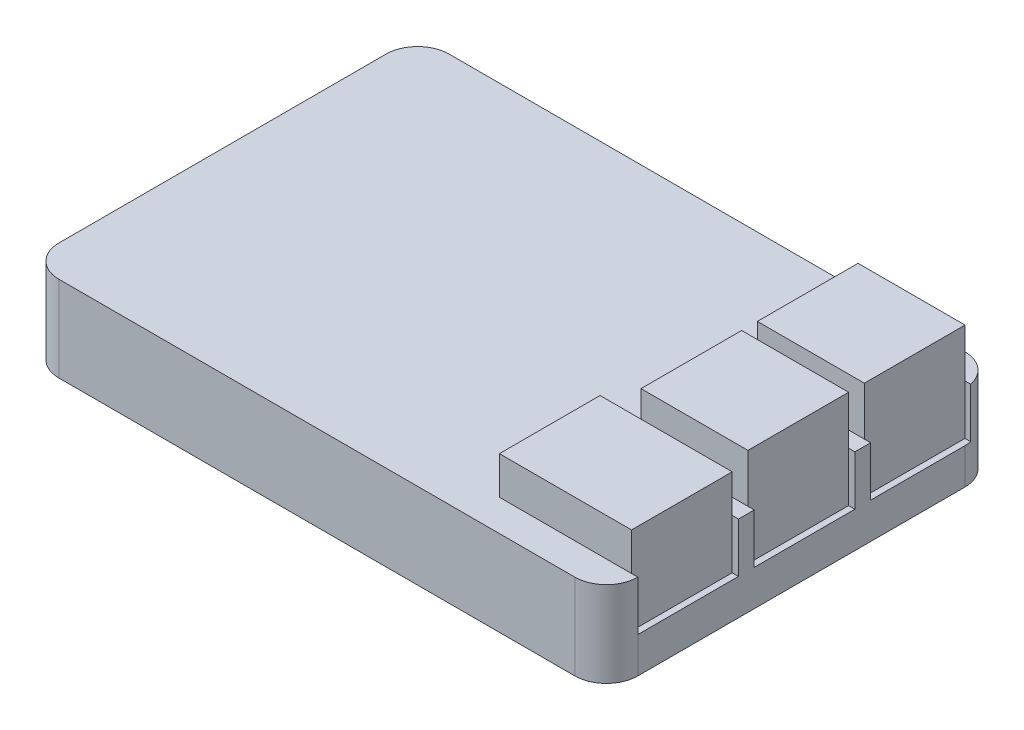
ISO-10303-21;
HEADER;
FILE_DESCRIPTION(('STEP AP214'),'2;1');
FILE_NAME('part.step','',(''),(''),'','','');
FILE_SCHEMA(('AUTOMOTIVE_DESIGN { 1 0 10303 214 1 1 1 1 }'));
ENDSEC;
DATA;
#1=APPLICATION_CONTEXT('core data for automotive mechanical design processes');
#2=APPLICATION_PROTOCOL_DEFINITION('international standard','automotive_design',2000,#1);
#3=PRODUCT_CONTEXT('',#1,'mechanical');
#4=PRODUCT('Part','Part','',(#3));
#5=PRODUCT_RELATED_PRODUCT_CATEGORY('part','',(#4));
#6=PRODUCT_DEFINITION_FORMATION('','',#4);
#7=PRODUCT_DEFINITION_CONTEXT('part definition',#1,'design');
#8=PRODUCT_DEFINITION('design','',#6,#7);
#9=PRODUCT_DEFINITION_SHAPE('','',#8);
#10=(LENGTH_UNIT() NAMED_UNIT(*) SI_UNIT(.MILLI.,.METRE.));
#11=(NAMED_UNIT(*) PLANE_ANGLE_UNIT() SI_UNIT($,.RADIAN.));
#12=(NAMED_UNIT(*) SI_UNIT($,.STERADIAN.) SOLID_ANGLE_UNIT());
#13=UNCERTAINTY_MEASURE_WITH_UNIT(LENGTH_MEASURE(1.E-05),#10,'distance_accuracy_value','');
#14=(GEOMETRIC_REPRESENTATION_CONTEXT(3) GLOBAL_UNCERTAINTY_ASSIGNED_CONTEXT((#13)) GLOBAL_UNIT_ASSIGNED_CONTEXT((#10,
#11,#12)) REPRESENTATION_CONTEXT('',''));
#15=CARTESIAN_POINT('',(0.,0.,0.));
#16=DIRECTION('',(0.,0.,1.));
#17=DIRECTION('',(1.,0.,0.));
#18=AXIS2_PLACEMENT_3D('',#15,#16,#17);
#19=CARTESIAN_POINT('',(0.,13.6,0.));
#20=DIRECTION('',(0.,1.,0.));
#21=DIRECTION('',(0.,0.,1.));
#22=AXIS2_PLACEMENT_3D('',#19,#20,#21);
#23=PLANE('',#22);
#24=DIRECTION('',(0.,0.,1.));
#25=VECTOR('',#24,1.);
#26=CARTESIAN_POINT('',(28.,13.6,0.));
#27=LINE('',#26,#25);
#28=CARTESIAN_POINT('',(28.,13.6,-27.));
#29=VERTEX_POINT('',#28);
#30=CARTESIAN_POINT('',(28.,13.6,-11.));
#31=VERTEX_POINT('',#30);
#32=EDGE_CURVE('E551',#29,#31,#27,.T.);
#33=ORIENTED_EDGE('',*,*,#32,.F.);
#34=DIRECTION('',(-1.,0.,0.));
#35=VECTOR('',#34,1.);
#36=CARTESIAN_POINT('',(0.,13.6,-27.));
#37=LINE('',#36,#35);
#38=CARTESIAN_POINT('',(45.,13.6,-27.));
#39=VERTEX_POINT('',#38);
#40=EDGE_CURVE('E246',#39,#29,#37,.T.);
#41=ORIENTED_EDGE('',*,*,#40,.F.);
#42=DIRECTION('',(1.,0.,0.));
#43=VECTOR('',#42,1.);
#44=CARTESIAN_POINT('',(45.,13.6,-27.));
#45=LINE('',#44,#43);
#46=CARTESIAN_POINT('',(45.8989794855664,13.6,-27.));
#47=VERTEX_POINT('',#46);
#48=EDGE_CURVE('E324',#39,#47,#45,.T.);
#49=ORIENTED_EDGE('',*,*,#48,.T.);
#50=CARTESIAN_POINT('',(41.,13.6,-26.));
#51=DIRECTION('',(0.,1.,0.));
#52=DIRECTION('',(0.,0.,1.));
#53=AXIS2_PLACEMENT_3D('',#50,#51,#52);
#54=CIRCLE('',#53,5.);
#55=CARTESIAN_POINT('',(41.,13.6,-31.));
#56=VERTEX_POINT('',#55);
#57=EDGE_CURVE('E397',#47,#56,#54,.T.);
#58=ORIENTED_EDGE('',*,*,#57,.T.);
#59=DIRECTION('',(1.,0.,0.));
#60=VECTOR('',#59,1.);
#61=CARTESIAN_POINT('',(0.,13.6,-31.));
#62=LINE('',#61,#60);
#63=CARTESIAN_POINT('',(-41.,13.6,-31.));
#64=VERTEX_POINT('',#63);
#65=EDGE_CURVE('E399',#64,#56,#62,.T.);
#66=ORIENTED_EDGE('',*,*,#65,.F.);
#67=CARTESIAN_POINT('',(-41.,13.6,-26.));
#68=DIRECTION('',(0.,1.,0.));
#69=DIRECTION('',(0.,0.,1.));
#70=AXIS2_PLACEMENT_3D('',#67,#68,#69);
#71=CIRCLE('',#70,5.);
#72=CARTESIAN_POINT('',(-46.,13.6,-26.));
#73=VERTEX_POINT('',#72);
#74=EDGE_CURVE('E402',#64,#73,#71,.T.);
#75=ORIENTED_EDGE('',*,*,#74,.T.);
#76=DIRECTION('',(0.,0.,1.));
#77=VECTOR('',#76,1.);
#78=CARTESIAN_POINT('',(-46.,13.6,0.));
#79=LINE('',#78,#77);
#80=CARTESIAN_POINT('',(-46.,13.6,26.));
#81=VERTEX_POINT('',#80);
#82=EDGE_CURVE('E383',#73,#81,#79,.T.);
#83=ORIENTED_EDGE('',*,*,#82,.T.);
#84=CARTESIAN_POINT('',(-41.,13.6,26.));
#85=DIRECTION('',(0.,1.,0.));
#86=DIRECTION('',(0.,0.,1.));
#87=AXIS2_PLACEMENT_3D('',#84,#85,#86);
#88=CIRCLE('',#87,5.);
#89=CARTESIAN_POINT('',(-41.,13.6,31.));
#90=VERTEX_POINT('',#89);
#91=EDGE_CURVE('E386',#81,#90,#88,.T.);
#92=ORIENTED_EDGE('',*,*,#91,.T.);
#93=DIRECTION('',(1.,0.,0.));
#94=VECTOR('',#93,1.);
#95=CARTESIAN_POINT('',(0.,13.6,31.));
#96=LINE('',#95,#94);
#97=CARTESIAN_POINT('',(41.,13.6,31.));
#98=VERTEX_POINT('',#97);
#99=EDGE_CURVE('E389',#90,#98,#96,.T.);
#100=ORIENTED_EDGE('',*,*,#99,.T.);
#101=CARTESIAN_POINT('',(41.,13.6,26.));
#102=DIRECTION('',(0.,1.,0.));
#103=DIRECTION('',(0.,0.,1.));
#104=AXIS2_PLACEMENT_3D('',#101,#102,#103);
#105=CIRCLE('',#104,5.);
#106=CARTESIAN_POINT('',(46.,13.6,26.));
#107=VERTEX_POINT('',#106);
#108=EDGE_CURVE('E391',#98,#107,#105,.T.);
#109=ORIENTED_EDGE('',*,*,#108,.T.);
#110=DIRECTION('',(1.,0.,0.));
#111=VECTOR('',#110,1.);
#112=CARTESIAN_POINT('',(45.,13.6,26.));
#113=LINE('',#112,#111);
#114=CARTESIAN_POINT('',(45.,13.6,26.));
#115=VERTEX_POINT('',#114);
#116=EDGE_CURVE('E375',#115,#107,#113,.T.);
#117=ORIENTED_EDGE('',*,*,#116,.F.);
#118=DIRECTION('',(-1.,0.,0.));
#119=VECTOR('',#118,1.);
#120=CARTESIAN_POINT('',(0.,13.6,26.));
#121=LINE('',#120,#119);
#122=CARTESIAN_POINT('',(24.,13.6,26.));
#123=VERTEX_POINT('',#122);
#124=EDGE_CURVE('E285',#115,#123,#121,.T.);
#125=ORIENTED_EDGE('',*,*,#124,.T.);
#126=DIRECTION('',(0.,0.,1.));
#127=VECTOR('',#126,1.);
#128=CARTESIAN_POINT('',(24.,13.6,0.));
#129=LINE('',#128,#127);
#130=CARTESIAN_POINT('',(24.,13.6,10.));
#131=VERTEX_POINT('',#130);
#132=EDGE_CURVE('E50',#131,#123,#129,.T.);
#133=ORIENTED_EDGE('',*,*,#132,.F.);
#134=DIRECTION('',(-1.,0.,0.));
#135=VECTOR('',#134,1.);
#136=CARTESIAN_POINT('',(0.,13.6,10.));
#137=LINE('',#136,#135);
#138=CARTESIAN_POINT('',(45.,13.6,10.));
#139=VERTEX_POINT('',#138);
#140=EDGE_CURVE('E55',#139,#131,#137,.T.);
#141=ORIENTED_EDGE('',*,*,#140,.F.);
#142=DIRECTION('',(1.,0.,0.));
#143=VECTOR('',#142,1.);
#144=CARTESIAN_POINT('',(45.,13.6,10.));
#145=LINE('',#144,#143);
#146=CARTESIAN_POINT('',(46.,13.6,10.));
#147=VERTEX_POINT('',#146);
#148=EDGE_CURVE('E378',#139,#147,#145,.T.);
#149=ORIENTED_EDGE('',*,*,#148,.T.);
#150=DIRECTION('',(0.,0.,1.));
#151=VECTOR('',#150,1.);
#152=CARTESIAN_POINT('',(46.,13.6,0.));
#153=LINE('',#152,#151);
#154=CARTESIAN_POINT('',(46.,13.6,7.5));
#155=VERTEX_POINT('',#154);
#156=EDGE_CURVE('E394',#155,#147,#153,.T.);
#157=ORIENTED_EDGE('',*,*,#156,.F.);
#158=DIRECTION('',(1.,0.,0.));
#159=VECTOR('',#158,1.);
#160=CARTESIAN_POINT('',(45.,13.6,7.5));
#161=LINE('',#160,#159);
#162=CARTESIAN_POINT('',(45.,13.6,7.5));
#163=VERTEX_POINT('',#162);
#164=EDGE_CURVE('E352',#163,#155,#161,.T.);
#165=ORIENTED_EDGE('',*,*,#164,.F.);
#166=DIRECTION('',(-1.,0.,0.));
#167=VECTOR('',#166,1.);
#168=CARTESIAN_POINT('',(0.,13.6,7.50000000000001));
#169=LINE('',#168,#167);
#170=CARTESIAN_POINT('',(28.,13.6,7.50000000000001));
#171=VERTEX_POINT('',#170);
#172=EDGE_CURVE('E261',#163,#171,#169,.T.);
#173=ORIENTED_EDGE('',*,*,#172,.T.);
#174=DIRECTION('',(0.,0.,1.));
#175=VECTOR('',#174,1.);
#176=CARTESIAN_POINT('',(28.,13.6,0.));
#177=LINE('',#176,#175);
#178=CARTESIAN_POINT('',(28.,13.6,-8.49999999999999));
#179=VERTEX_POINT('',#178);
#180=EDGE_CURVE('E251',#179,#171,#177,.T.);
#181=ORIENTED_EDGE('',*,*,#180,.F.);
#182=DIRECTION('',(-1.,0.,0.));
#183=VECTOR('',#182,1.);
#184=CARTESIAN_POINT('',(0.,13.6,-8.49999999999999));
#185=LINE('',#184,#183);
#186=CARTESIAN_POINT('',(45.,13.6,-8.49999999999999));
#187=VERTEX_POINT('',#186);
#188=EDGE_CURVE('E248',#187,#179,#185,.T.);
#189=ORIENTED_EDGE('',*,*,#188,.F.);
#190=DIRECTION('',(1.,0.,0.));
#191=VECTOR('',#190,1.);
#192=CARTESIAN_POINT('',(45.,13.6,-8.49999999999999));
#193=LINE('',#192,#191);
#194=CARTESIAN_POINT('',(46.,13.6,-8.49999999999999));
#195=VERTEX_POINT('',#194);
#196=EDGE_CURVE('E355',#187,#195,#193,.T.);
#197=ORIENTED_EDGE('',*,*,#196,.T.);
#198=CARTESIAN_POINT('',(46.,13.6,-11.));
#199=VERTEX_POINT('',#198);
#200=EDGE_CURVE('E395',#199,#195,#153,.T.);
#201=ORIENTED_EDGE('',*,*,#200,.F.);
#202=DIRECTION('',(1.,0.,0.));
#203=VECTOR('',#202,1.);
#204=CARTESIAN_POINT('',(45.,13.6,-11.));
#205=LINE('',#204,#203);
#206=CARTESIAN_POINT('',(45.,13.6,-11.));
#207=VERTEX_POINT('',#206);
#208=EDGE_CURVE('E321',#207,#199,#205,.T.);
#209=ORIENTED_EDGE('',*,*,#208,.F.);
#210=DIRECTION('',(-1.,0.,0.));
#211=VECTOR('',#210,1.);
#212=CARTESIAN_POINT('',(0.,13.6,-11.));
#213=LINE('',#212,#211);
#214=EDGE_CURVE('E242',#207,#31,#213,.T.);
#215=ORIENTED_EDGE('',*,*,#214,.T.);
#216=EDGE_LOOP('',(#33,#41,#49,#58,#66,#75,#83,#92,#100,#109,#117,#125,#133,#141,#149,#157,#165,
#173,#181,#189,#197,#201,#209,#215));
#217=FACE_BOUND('',#216,.T.);
#218=ADVANCED_FACE('F35',(#217),#23,.T.);
#219=CARTESIAN_POINT('',(-46.,13.6,0.));
#220=DIRECTION('',(1.,0.,0.));
#221=DIRECTION('',(0.,0.,-1.));
#222=AXIS2_PLACEMENT_3D('',#219,#220,#221);
#223=PLANE('',#222);
#224=DIRECTION('',(0.,0.,1.));
#225=VECTOR('',#224,1.);
#226=CARTESIAN_POINT('',(-46.,0.,0.));
#227=LINE('',#226,#225);
#228=CARTESIAN_POINT('',(-46.,0.,-26.));
#229=VERTEX_POINT('',#228);
#230=CARTESIAN_POINT('',(-46.,0.,26.));
#231=VERTEX_POINT('',#230);
#232=EDGE_CURVE('E377',#229,#231,#227,.T.);
#233=ORIENTED_EDGE('',*,*,#232,.T.);
#234=DIRECTION('',(0.,-1.,0.));
#235=VECTOR('',#234,1.);
#236=CARTESIAN_POINT('',(-46.,13.6,26.));
#237=LINE('',#236,#235);
#238=EDGE_CURVE('E43',#81,#231,#237,.T.);
#239=ORIENTED_EDGE('',*,*,#238,.F.);
#240=ORIENTED_EDGE('',*,*,#82,.F.);
#241=DIRECTION('',(0.,-1.,0.));
#242=VECTOR('',#241,1.);
#243=CARTESIAN_POINT('',(-46.,13.6,-26.));
#244=LINE('',#243,#242);
#245=EDGE_CURVE('E404',#73,#229,#244,.T.);
#246=ORIENTED_EDGE('',*,*,#245,.T.);
#247=EDGE_LOOP('',(#233,#239,#240,#246));
#248=FACE_BOUND('',#247,.T.);
#249=ADVANCED_FACE('F37',(#248),#223,.F.);
#250=CARTESIAN_POINT('',(-41.,13.6,26.));
#251=DIRECTION('',(0.,-1.,0.));
#252=DIRECTION('',(0.,0.,-1.));
#253=AXIS2_PLACEMENT_3D('',#250,#251,#252);
#254=CYLINDRICAL_SURFACE('',#253,5.);
#255=CARTESIAN_POINT('',(-41.,0.,26.));
#256=DIRECTION('',(0.,1.,0.));
#257=DIRECTION('',(0.,0.,1.));
#258=AXIS2_PLACEMENT_3D('',#255,#256,#257);
#259=CIRCLE('',#258,5.);
#260=CARTESIAN_POINT('',(-41.,0.,31.));
#261=VERTEX_POINT('',#260);
#262=EDGE_CURVE('E407',#231,#261,#259,.T.);
#263=ORIENTED_EDGE('',*,*,#262,.T.);
#264=DIRECTION('',(0.,-1.,0.));
#265=VECTOR('',#264,1.);
#266=CARTESIAN_POINT('',(-41.,13.6,31.));
#267=LINE('',#266,#265);
#268=EDGE_CURVE('E439',#90,#261,#267,.T.);
#269=ORIENTED_EDGE('',*,*,#268,.F.);
#270=ORIENTED_EDGE('',*,*,#91,.F.);
#271=ORIENTED_EDGE('',*,*,#238,.T.);
#272=EDGE_LOOP('',(#263,#269,#270,#271));
#273=FACE_BOUND('',#272,.T.);
#274=ADVANCED_FACE('F444',(#273),#254,.T.);
#275=CARTESIAN_POINT('',(0.,13.6,31.));
#276=DIRECTION('',(0.,0.,-1.));
#277=DIRECTION('',(-1.,0.,0.));
#278=AXIS2_PLACEMENT_3D('',#275,#276,#277);
#279=PLANE('',#278);
#280=DIRECTION('',(1.,0.,0.));
#281=VECTOR('',#280,1.);
#282=CARTESIAN_POINT('',(0.,0.,31.));
#283=LINE('',#282,#281);
#284=CARTESIAN_POINT('',(41.,0.,31.));
#285=VERTEX_POINT('',#284);
#286=EDGE_CURVE('E409',#261,#285,#283,.T.);
#287=ORIENTED_EDGE('',*,*,#286,.T.);
#288=DIRECTION('',(0.,-1.,0.));
#289=VECTOR('',#288,1.);
#290=CARTESIAN_POINT('',(41.,13.6,31.));
#291=LINE('',#290,#289);
#292=EDGE_CURVE('E436',#98,#285,#291,.T.);
#293=ORIENTED_EDGE('',*,*,#292,.F.);
#294=ORIENTED_EDGE('',*,*,#99,.F.);
#295=ORIENTED_EDGE('',*,*,#268,.T.);
#296=EDGE_LOOP('',(#287,#293,#294,#295));
#297=FACE_BOUND('',#296,.T.);
#298=ADVANCED_FACE('F458',(#297),#279,.F.);
#299=CARTESIAN_POINT('',(41.,13.6,26.));
#300=DIRECTION('',(0.,-1.,0.));
#301=DIRECTION('',(0.,0.,-1.));
#302=AXIS2_PLACEMENT_3D('',#299,#300,#301);
#303=CYLINDRICAL_SURFACE('',#302,5.);
#304=CARTESIAN_POINT('',(41.,0.,26.));
#305=DIRECTION('',(0.,1.,0.));
#306=DIRECTION('',(0.,0.,1.));
#307=AXIS2_PLACEMENT_3D('',#304,#305,#306);
#308=CIRCLE('',#307,5.);
#309=CARTESIAN_POINT('',(46.,0.,26.));
#310=VERTEX_POINT('',#309);
#311=EDGE_CURVE('E411',#285,#310,#308,.T.);
#312=ORIENTED_EDGE('',*,*,#311,.T.);
#313=DIRECTION('',(0.,-1.,0.));
#314=VECTOR('',#313,1.);
#315=CARTESIAN_POINT('',(46.,13.6,26.));
#316=LINE('',#315,#314);
#317=CARTESIAN_POINT('',(46.,5.7,26.));
#318=VERTEX_POINT('',#317);
#319=EDGE_CURVE('E432',#318,#310,#316,.T.);
#320=ORIENTED_EDGE('',*,*,#319,.F.);
#321=EDGE_CURVE('E433',#107,#318,#316,.T.);
#322=ORIENTED_EDGE('',*,*,#321,.F.);
#323=ORIENTED_EDGE('',*,*,#108,.F.);
#324=ORIENTED_EDGE('',*,*,#292,.T.);
#325=EDGE_LOOP('',(#312,#320,#322,#323,#324));
#326=FACE_BOUND('',#325,.T.);
#327=ADVANCED_FACE('F462',(#326),#303,.T.);
#328=CARTESIAN_POINT('',(46.,13.6,0.));
#329=DIRECTION('',(1.,0.,0.));
#330=DIRECTION('',(0.,0.,-1.));
#331=AXIS2_PLACEMENT_3D('',#328,#329,#330);
#332=PLANE('',#331);
#333=DIRECTION('',(0.,-1.,0.));
#334=VECTOR('',#333,1.);
#335=CARTESIAN_POINT('',(46.,13.6,-11.));
#336=LINE('',#335,#334);
#337=CARTESIAN_POINT('',(46.,5.7,-11.));
#338=VERTEX_POINT('',#337);
#339=EDGE_CURVE('E306',#199,#338,#336,.T.);
#340=ORIENTED_EDGE('',*,*,#339,.F.);
#341=ORIENTED_EDGE('',*,*,#200,.T.);
#342=DIRECTION('',(0.,1.,0.));
#343=VECTOR('',#342,1.);
#344=CARTESIAN_POINT('',(46.,13.6,-8.49999999999999));
#345=LINE('',#344,#343);
#346=CARTESIAN_POINT('',(46.,5.7,-8.49999999999999));
#347=VERTEX_POINT('',#346);
#348=EDGE_CURVE('E338',#347,#195,#345,.T.);
#349=ORIENTED_EDGE('',*,*,#348,.F.);
#350=DIRECTION('',(0.,0.,-1.));
#351=VECTOR('',#350,1.);
#352=CARTESIAN_POINT('',(46.,5.7,7.50000000000001));
#353=LINE('',#352,#351);
#354=CARTESIAN_POINT('',(46.,5.7,7.50000000000001));
#355=VERTEX_POINT('',#354);
#356=EDGE_CURVE('E347',#355,#347,#353,.T.);
#357=ORIENTED_EDGE('',*,*,#356,.F.);
#358=DIRECTION('',(0.,-1.,0.));
#359=VECTOR('',#358,1.);
#360=CARTESIAN_POINT('',(46.,13.6,7.5));
#361=LINE('',#360,#359);
#362=EDGE_CURVE('E333',#155,#355,#361,.T.);
#363=ORIENTED_EDGE('',*,*,#362,.F.);
#364=ORIENTED_EDGE('',*,*,#156,.T.);
#365=DIRECTION('',(0.,1.,0.));
#366=VECTOR('',#365,1.);
#367=CARTESIAN_POINT('',(46.,13.6,10.));
#368=LINE('',#367,#366);
#369=CARTESIAN_POINT('',(46.,5.7,10.));
#370=VERTEX_POINT('',#369);
#371=EDGE_CURVE('E365',#370,#147,#368,.T.);
#372=ORIENTED_EDGE('',*,*,#371,.F.);
#373=DIRECTION('',(0.,0.,-1.));
#374=VECTOR('',#373,1.);
#375=CARTESIAN_POINT('',(46.,5.7,26.));
#376=LINE('',#375,#374);
#377=EDGE_CURVE('E354',#318,#370,#376,.T.);
#378=ORIENTED_EDGE('',*,*,#377,.F.);
#379=ORIENTED_EDGE('',*,*,#319,.T.);
#380=DIRECTION('',(0.,0.,1.));
#381=VECTOR('',#380,1.);
#382=CARTESIAN_POINT('',(46.,0.,0.));
#383=LINE('',#382,#381);
#384=CARTESIAN_POINT('',(46.,0.,-26.));
#385=VERTEX_POINT('',#384);
#386=EDGE_CURVE('E414',#385,#310,#383,.T.);
#387=ORIENTED_EDGE('',*,*,#386,.F.);
#388=DIRECTION('',(0.,-1.,0.));
#389=VECTOR('',#388,1.);
#390=CARTESIAN_POINT('',(46.,13.6,-26.));
#391=LINE('',#390,#389);
#392=CARTESIAN_POINT('',(46.,5.7,-26.));
#393=VERTEX_POINT('',#392);
#394=EDGE_CURVE('E430',#393,#385,#391,.T.);
#395=ORIENTED_EDGE('',*,*,#394,.F.);
#396=DIRECTION('',(0.,0.,-1.));
#397=VECTOR('',#396,1.);
#398=CARTESIAN_POINT('',(46.,5.7,-11.));
#399=LINE('',#398,#397);
#400=EDGE_CURVE('E311',#338,#393,#399,.T.);
#401=ORIENTED_EDGE('',*,*,#400,.F.);
#402=EDGE_LOOP('',(#340,#341,#349,#357,#363,#364,#372,#378,#379,#387,#395,#401));
#403=FACE_BOUND('',#402,.T.);
#404=ADVANCED_FACE('F479',(#403),#332,.T.);
#405=CARTESIAN_POINT('',(41.,13.6,-26.));
#406=DIRECTION('',(0.,-1.,0.));
#407=DIRECTION('',(0.,0.,-1.));
#408=AXIS2_PLACEMENT_3D('',#405,#406,#407);
#409=CYLINDRICAL_SURFACE('',#408,5.);
#410=ORIENTED_EDGE('',*,*,#57,.F.);
#411=DIRECTION('',(0.,-1.,0.));
#412=VECTOR('',#411,1.);
#413=CARTESIAN_POINT('',(45.8989794855664,13.6,-27.));
#414=LINE('',#413,#412);
#415=CARTESIAN_POINT('',(45.8989794855664,5.7,-27.));
#416=VERTEX_POINT('',#415);
#417=EDGE_CURVE('E323',#47,#416,#414,.T.);
#418=ORIENTED_EDGE('',*,*,#417,.T.);
#419=CARTESIAN_POINT('',(41.,5.7,-26.));
#420=DIRECTION('',(0.,-1.,0.));
#421=DIRECTION('',(0.,0.,-1.));
#422=AXIS2_PLACEMENT_3D('',#419,#420,#421);
#423=CIRCLE('',#422,5.);
#424=EDGE_CURVE('E11',#416,#393,#423,.T.);
#425=ORIENTED_EDGE('',*,*,#424,.T.);
#426=ORIENTED_EDGE('',*,*,#394,.T.);
#427=CARTESIAN_POINT('',(41.,0.,-26.));
#428=DIRECTION('',(0.,1.,0.));
#429=DIRECTION('',(0.,0.,1.));
#430=AXIS2_PLACEMENT_3D('',#427,#428,#429);
#431=CIRCLE('',#430,5.);
#432=CARTESIAN_POINT('',(41.,0.,-31.));
#433=VERTEX_POINT('',#432);
#434=EDGE_CURVE('E417',#385,#433,#431,.T.);
#435=ORIENTED_EDGE('',*,*,#434,.T.);
#436=DIRECTION('',(0.,-1.,0.));
#437=VECTOR('',#436,1.);
#438=CARTESIAN_POINT('',(41.,13.6,-31.));
#439=LINE('',#438,#437);
#440=EDGE_CURVE('E428',#56,#433,#439,.T.);
#441=ORIENTED_EDGE('',*,*,#440,.F.);
#442=EDGE_LOOP('',(#410,#418,#425,#426,#435,#441));
#443=FACE_BOUND('',#442,.T.);
#444=ADVANCED_FACE('F561',(#443),#409,.T.);
#445=CARTESIAN_POINT('',(0.,13.6,-31.));
#446=DIRECTION('',(0.,0.,-1.));
#447=DIRECTION('',(-1.,0.,0.));
#448=AXIS2_PLACEMENT_3D('',#445,#446,#447);
#449=PLANE('',#448);
#450=DIRECTION('',(1.,0.,0.));
#451=VECTOR('',#450,1.);
#452=CARTESIAN_POINT('',(0.,0.,-31.));
#453=LINE('',#452,#451);
#454=CARTESIAN_POINT('',(-41.,0.,-31.));
#455=VERTEX_POINT('',#454);
#456=EDGE_CURVE('E420',#455,#433,#453,.T.);
#457=ORIENTED_EDGE('',*,*,#456,.F.);
#458=DIRECTION('',(0.,-1.,0.));
#459=VECTOR('',#458,1.);
#460=CARTESIAN_POINT('',(-41.,13.6,-31.));
#461=LINE('',#460,#459);
#462=EDGE_CURVE('E426',#64,#455,#461,.T.);
#463=ORIENTED_EDGE('',*,*,#462,.F.);
#464=ORIENTED_EDGE('',*,*,#65,.T.);
#465=ORIENTED_EDGE('',*,*,#440,.T.);
#466=EDGE_LOOP('',(#457,#463,#464,#465));
#467=FACE_BOUND('',#466,.T.);
#468=ADVANCED_FACE('F471',(#467),#449,.T.);
#469=CARTESIAN_POINT('',(-41.,13.6,-26.));
#470=DIRECTION('',(0.,-1.,0.));
#471=DIRECTION('',(0.,0.,-1.));
#472=AXIS2_PLACEMENT_3D('',#469,#470,#471);
#473=CYLINDRICAL_SURFACE('',#472,5.);
#474=CARTESIAN_POINT('',(-41.,0.,-26.));
#475=DIRECTION('',(0.,1.,0.));
#476=DIRECTION('',(0.,0.,1.));
#477=AXIS2_PLACEMENT_3D('',#474,#475,#476);
#478=CIRCLE('',#477,5.);
#479=EDGE_CURVE('E387',#455,#229,#478,.T.);
#480=ORIENTED_EDGE('',*,*,#479,.T.);
#481=ORIENTED_EDGE('',*,*,#245,.F.);
#482=ORIENTED_EDGE('',*,*,#74,.F.);
#483=ORIENTED_EDGE('',*,*,#462,.T.);
#484=EDGE_LOOP('',(#480,#481,#482,#483));
#485=FACE_BOUND('',#484,.T.);
#486=ADVANCED_FACE('F469',(#485),#473,.T.);
#487=CARTESIAN_POINT('',(0.,0.,0.));
#488=DIRECTION('',(0.,1.,0.));
#489=DIRECTION('',(0.,0.,1.));
#490=AXIS2_PLACEMENT_3D('',#487,#488,#489);
#491=PLANE('',#490);
#492=ORIENTED_EDGE('',*,*,#232,.F.);
#493=ORIENTED_EDGE('',*,*,#479,.F.);
#494=ORIENTED_EDGE('',*,*,#456,.T.);
#495=ORIENTED_EDGE('',*,*,#434,.F.);
#496=ORIENTED_EDGE('',*,*,#386,.T.);
#497=ORIENTED_EDGE('',*,*,#311,.F.);
#498=ORIENTED_EDGE('',*,*,#286,.F.);
#499=ORIENTED_EDGE('',*,*,#262,.F.);
#500=EDGE_LOOP('',(#492,#493,#494,#495,#496,#497,#498,#499));
#501=FACE_BOUND('',#500,.T.);
#502=ADVANCED_FACE('F452',(#501),#491,.F.);
#503=CARTESIAN_POINT('',(45.,13.6,26.));
#504=DIRECTION('',(0.,0.,1.));
#505=DIRECTION('',(1.,0.,0.));
#506=AXIS2_PLACEMENT_3D('',#503,#504,#505);
#507=PLANE('',#506);
#508=ORIENTED_EDGE('',*,*,#321,.T.);
#509=DIRECTION('',(1.,0.,0.));
#510=VECTOR('',#509,1.);
#511=CARTESIAN_POINT('',(45.,5.7,26.));
#512=LINE('',#511,#510);
#513=CARTESIAN_POINT('',(45.,5.7,26.));
#514=VERTEX_POINT('',#513);
#515=EDGE_CURVE('E370',#514,#318,#512,.T.);
#516=ORIENTED_EDGE('',*,*,#515,.F.);
#517=DIRECTION('',(0.,-1.,0.));
#518=VECTOR('',#517,1.);
#519=CARTESIAN_POINT('',(45.,13.6,26.));
#520=LINE('',#519,#518);
#521=EDGE_CURVE('E361',#115,#514,#520,.T.);
#522=ORIENTED_EDGE('',*,*,#521,.F.);
#523=ORIENTED_EDGE('',*,*,#116,.T.);
#524=EDGE_LOOP('',(#508,#516,#522,#523));
#525=FACE_BOUND('',#524,.T.);
#526=ADVANCED_FACE('F488',(#525),#507,.F.);
#527=CARTESIAN_POINT('',(45.,13.6,10.));
#528=DIRECTION('',(0.,0.,-1.));
#529=DIRECTION('',(-1.,0.,0.));
#530=AXIS2_PLACEMENT_3D('',#527,#528,#529);
#531=PLANE('',#530);
#532=ORIENTED_EDGE('',*,*,#371,.T.);
#533=ORIENTED_EDGE('',*,*,#148,.F.);
#534=DIRECTION('',(0.,1.,0.));
#535=VECTOR('',#534,1.);
#536=CARTESIAN_POINT('',(45.,13.6,10.));
#537=LINE('',#536,#535);
#538=CARTESIAN_POINT('',(45.,5.7,10.));
#539=VERTEX_POINT('',#538);
#540=EDGE_CURVE('E368',#539,#139,#537,.T.);
#541=ORIENTED_EDGE('',*,*,#540,.F.);
#542=DIRECTION('',(1.,0.,0.));
#543=VECTOR('',#542,1.);
#544=CARTESIAN_POINT('',(45.,5.7,10.));
#545=LINE('',#544,#543);
#546=EDGE_CURVE('E380',#539,#370,#545,.T.);
#547=ORIENTED_EDGE('',*,*,#546,.T.);
#548=EDGE_LOOP('',(#532,#533,#541,#547));
#549=FACE_BOUND('',#548,.T.);
#550=ADVANCED_FACE('F506',(#549),#531,.F.);
#551=CARTESIAN_POINT('',(45.,5.7,26.));
#552=DIRECTION('',(0.,-1.,0.));
#553=DIRECTION('',(0.,0.,-1.));
#554=AXIS2_PLACEMENT_3D('',#551,#552,#553);
#555=PLANE('',#554);
#556=ORIENTED_EDGE('',*,*,#377,.T.);
#557=ORIENTED_EDGE('',*,*,#546,.F.);
#558=DIRECTION('',(0.,0.,-1.));
#559=VECTOR('',#558,1.);
#560=CARTESIAN_POINT('',(45.,5.7,26.));
#561=LINE('',#560,#559);
#562=EDGE_CURVE('E364',#514,#539,#561,.T.);
#563=ORIENTED_EDGE('',*,*,#562,.F.);
#564=ORIENTED_EDGE('',*,*,#515,.T.);
#565=EDGE_LOOP('',(#556,#557,#563,#564));
#566=FACE_BOUND('',#565,.T.);
#567=ADVANCED_FACE('F484',(#566),#555,.F.);
#568=CARTESIAN_POINT('',(45.,0.,0.));
#569=DIRECTION('',(1.,0.,0.));
#570=DIRECTION('',(0.,0.,-1.));
#571=AXIS2_PLACEMENT_3D('',#568,#569,#570);
#572=PLANE('',#571);
#573=ORIENTED_EDGE('',*,*,#521,.T.);
#574=ORIENTED_EDGE('',*,*,#562,.T.);
#575=ORIENTED_EDGE('',*,*,#540,.T.);
#576=DIRECTION('',(0.,-1.,0.));
#577=VECTOR('',#576,1.);
#578=CARTESIAN_POINT('',(45.,19.6,10.));
#579=LINE('',#578,#577);
#580=CARTESIAN_POINT('',(45.,19.6,10.));
#581=VERTEX_POINT('',#580);
#582=EDGE_CURVE('E292',#581,#139,#579,.T.);
#583=ORIENTED_EDGE('',*,*,#582,.F.);
#584=DIRECTION('',(0.,0.,-1.));
#585=VECTOR('',#584,1.);
#586=CARTESIAN_POINT('',(45.,19.6,0.));
#587=LINE('',#586,#585);
#588=CARTESIAN_POINT('',(45.,19.6,26.));
#589=VERTEX_POINT('',#588);
#590=EDGE_CURVE('E290',#589,#581,#587,.T.);
#591=ORIENTED_EDGE('',*,*,#590,.F.);
#592=DIRECTION('',(0.,-1.,0.));
#593=VECTOR('',#592,1.);
#594=CARTESIAN_POINT('',(45.,19.6,26.));
#595=LINE('',#594,#593);
#596=EDGE_CURVE('E298',#589,#115,#595,.T.);
#597=ORIENTED_EDGE('',*,*,#596,.T.);
#598=EDGE_LOOP('',(#573,#574,#575,#583,#591,#597));
#599=FACE_BOUND('',#598,.T.);
#600=ADVANCED_FACE('F490',(#599),#572,.T.);
#601=CARTESIAN_POINT('',(45.,13.6,7.5));
#602=DIRECTION('',(0.,0.,1.));
#603=DIRECTION('',(0.,-1.,0.));
#604=AXIS2_PLACEMENT_3D('',#601,#602,#603);
#605=PLANE('',#604);
#606=ORIENTED_EDGE('',*,*,#362,.T.);
#607=DIRECTION('',(1.,0.,0.));
#608=VECTOR('',#607,1.);
#609=CARTESIAN_POINT('',(45.,5.7,7.50000000000001));
#610=LINE('',#609,#608);
#611=CARTESIAN_POINT('',(45.,5.7,7.50000000000001));
#612=VERTEX_POINT('',#611);
#613=EDGE_CURVE('E344',#612,#355,#610,.T.);
#614=ORIENTED_EDGE('',*,*,#613,.F.);
#615=DIRECTION('',(0.,-1.,0.));
#616=VECTOR('',#615,1.);
#617=CARTESIAN_POINT('',(45.,13.6,7.5));
#618=LINE('',#617,#616);
#619=EDGE_CURVE('E334',#163,#612,#618,.T.);
#620=ORIENTED_EDGE('',*,*,#619,.F.);
#621=ORIENTED_EDGE('',*,*,#164,.T.);
#622=EDGE_LOOP('',(#606,#614,#620,#621));
#623=FACE_BOUND('',#622,.T.);
#624=ADVANCED_FACE('F513',(#623),#605,.F.);
#625=CARTESIAN_POINT('',(45.,13.6,-8.49999999999999));
#626=DIRECTION('',(0.,0.,-1.));
#627=DIRECTION('',(0.,1.,0.));
#628=AXIS2_PLACEMENT_3D('',#625,#626,#627);
#629=PLANE('',#628);
#630=ORIENTED_EDGE('',*,*,#348,.T.);
#631=ORIENTED_EDGE('',*,*,#196,.F.);
#632=DIRECTION('',(0.,1.,0.));
#633=VECTOR('',#632,1.);
#634=CARTESIAN_POINT('',(45.,13.6,-8.49999999999999));
#635=LINE('',#634,#633);
#636=CARTESIAN_POINT('',(45.,5.7,-8.49999999999999));
#637=VERTEX_POINT('',#636);
#638=EDGE_CURVE('E341',#637,#187,#635,.T.);
#639=ORIENTED_EDGE('',*,*,#638,.F.);
#640=DIRECTION('',(1.,0.,0.));
#641=VECTOR('',#640,1.);
#642=CARTESIAN_POINT('',(45.,5.7,-8.49999999999999));
#643=LINE('',#642,#641);
#644=EDGE_CURVE('E358',#637,#347,#643,.T.);
#645=ORIENTED_EDGE('',*,*,#644,.T.);
#646=EDGE_LOOP('',(#630,#631,#639,#645));
#647=FACE_BOUND('',#646,.T.);
#648=ADVANCED_FACE('F535',(#647),#629,.F.);
#649=CARTESIAN_POINT('',(45.,5.7,7.50000000000001));
#650=DIRECTION('',(0.,-1.,0.));
#651=DIRECTION('',(0.,0.,-1.));
#652=AXIS2_PLACEMENT_3D('',#649,#650,#651);
#653=PLANE('',#652);
#654=ORIENTED_EDGE('',*,*,#356,.T.);
#655=ORIENTED_EDGE('',*,*,#644,.F.);
#656=DIRECTION('',(0.,0.,-1.));
#657=VECTOR('',#656,1.);
#658=CARTESIAN_POINT('',(45.,5.7,7.50000000000001));
#659=LINE('',#658,#657);
#660=EDGE_CURVE('E337',#612,#637,#659,.T.);
#661=ORIENTED_EDGE('',*,*,#660,.F.);
#662=ORIENTED_EDGE('',*,*,#613,.T.);
#663=EDGE_LOOP('',(#654,#655,#661,#662));
#664=FACE_BOUND('',#663,.T.);
#665=ADVANCED_FACE('F573',(#664),#653,.F.);
#666=CARTESIAN_POINT('',(45.,0.,0.));
#667=DIRECTION('',(1.,0.,0.));
#668=DIRECTION('',(0.,0.,-1.));
#669=AXIS2_PLACEMENT_3D('',#666,#667,#668);
#670=PLANE('',#669);
#671=ORIENTED_EDGE('',*,*,#619,.T.);
#672=ORIENTED_EDGE('',*,*,#660,.T.);
#673=ORIENTED_EDGE('',*,*,#638,.T.);
#674=DIRECTION('',(0.,-1.,0.));
#675=VECTOR('',#674,1.);
#676=CARTESIAN_POINT('',(45.,21.3,-8.49999999999999));
#677=LINE('',#676,#675);
#678=CARTESIAN_POINT('',(45.,21.3,-8.49999999999999));
#679=VERTEX_POINT('',#678);
#680=EDGE_CURVE('E267',#679,#187,#677,.T.);
#681=ORIENTED_EDGE('',*,*,#680,.F.);
#682=DIRECTION('',(0.,0.,-1.));
#683=VECTOR('',#682,1.);
#684=CARTESIAN_POINT('',(45.,21.3,0.));
#685=LINE('',#684,#683);
#686=CARTESIAN_POINT('',(45.,21.3,7.5));
#687=VERTEX_POINT('',#686);
#688=EDGE_CURVE('E266',#687,#679,#685,.T.);
#689=ORIENTED_EDGE('',*,*,#688,.F.);
#690=DIRECTION('',(0.,-1.,0.));
#691=VECTOR('',#690,1.);
#692=CARTESIAN_POINT('',(45.,21.3,7.5));
#693=LINE('',#692,#691);
#694=EDGE_CURVE('E274',#687,#163,#693,.T.);
#695=ORIENTED_EDGE('',*,*,#694,.T.);
#696=EDGE_LOOP('',(#671,#672,#673,#681,#689,#695));
#697=FACE_BOUND('',#696,.T.);
#698=ADVANCED_FACE('F517',(#697),#670,.T.);
#699=CARTESIAN_POINT('',(45.,5.7,-11.));
#700=DIRECTION('',(0.,-1.,0.));
#701=DIRECTION('',(0.,0.,-1.));
#702=AXIS2_PLACEMENT_3D('',#699,#700,#701);
#703=PLANE('',#702);
#704=DIRECTION('',(1.,0.,0.));
#705=VECTOR('',#704,1.);
#706=CARTESIAN_POINT('',(45.,5.7,-27.));
#707=LINE('',#706,#705);
#708=CARTESIAN_POINT('',(45.,5.7,-27.));
#709=VERTEX_POINT('',#708);
#710=EDGE_CURVE('E327',#709,#416,#707,.T.);
#711=ORIENTED_EDGE('',*,*,#710,.F.);
#712=DIRECTION('',(0.,0.,-1.));
#713=VECTOR('',#712,1.);
#714=CARTESIAN_POINT('',(45.,5.7,-11.));
#715=LINE('',#714,#713);
#716=CARTESIAN_POINT('',(45.,5.7,-11.));
#717=VERTEX_POINT('',#716);
#718=EDGE_CURVE('E310',#717,#709,#715,.T.);
#719=ORIENTED_EDGE('',*,*,#718,.F.);
#720=DIRECTION('',(1.,0.,0.));
#721=VECTOR('',#720,1.);
#722=CARTESIAN_POINT('',(45.,5.7,-11.));
#723=LINE('',#722,#721);
#724=EDGE_CURVE('E317',#717,#338,#723,.T.);
#725=ORIENTED_EDGE('',*,*,#724,.T.);
#726=ORIENTED_EDGE('',*,*,#400,.T.);
#727=ORIENTED_EDGE('',*,*,#424,.F.);
#728=EDGE_LOOP('',(#711,#719,#725,#726,#727));
#729=FACE_BOUND('',#728,.T.);
#730=ADVANCED_FACE('F563',(#729),#703,.F.);
#731=CARTESIAN_POINT('',(45.,13.6,-27.));
#732=DIRECTION('',(0.,0.,-1.));
#733=DIRECTION('',(0.,1.,0.));
#734=AXIS2_PLACEMENT_3D('',#731,#732,#733);
#735=PLANE('',#734);
#736=ORIENTED_EDGE('',*,*,#48,.F.);
#737=DIRECTION('',(0.,1.,0.));
#738=VECTOR('',#737,1.);
#739=CARTESIAN_POINT('',(45.,13.6,-27.));
#740=LINE('',#739,#738);
#741=EDGE_CURVE('E314',#709,#39,#740,.T.);
#742=ORIENTED_EDGE('',*,*,#741,.F.);
#743=ORIENTED_EDGE('',*,*,#710,.T.);
#744=ORIENTED_EDGE('',*,*,#417,.F.);
#745=EDGE_LOOP('',(#736,#742,#743,#744));
#746=FACE_BOUND('',#745,.T.);
#747=ADVANCED_FACE('F560',(#746),#735,.F.);
#748=CARTESIAN_POINT('',(45.,13.6,-11.));
#749=DIRECTION('',(0.,0.,1.));
#750=DIRECTION('',(1.,0.,0.));
#751=AXIS2_PLACEMENT_3D('',#748,#749,#750);
#752=PLANE('',#751);
#753=ORIENTED_EDGE('',*,*,#339,.T.);
#754=ORIENTED_EDGE('',*,*,#724,.F.);
#755=DIRECTION('',(0.,-1.,0.));
#756=VECTOR('',#755,1.);
#757=CARTESIAN_POINT('',(45.,13.6,-11.));
#758=LINE('',#757,#756);
#759=EDGE_CURVE('E307',#207,#717,#758,.T.);
#760=ORIENTED_EDGE('',*,*,#759,.F.);
#761=ORIENTED_EDGE('',*,*,#208,.T.);
#762=EDGE_LOOP('',(#753,#754,#760,#761));
#763=FACE_BOUND('',#762,.T.);
#764=ADVANCED_FACE('F540',(#763),#752,.F.);
#765=CARTESIAN_POINT('',(45.,0.,0.));
#766=DIRECTION('',(1.,0.,0.));
#767=DIRECTION('',(0.,0.,-1.));
#768=AXIS2_PLACEMENT_3D('',#765,#766,#767);
#769=PLANE('',#768);
#770=ORIENTED_EDGE('',*,*,#759,.T.);
#771=ORIENTED_EDGE('',*,*,#718,.T.);
#772=ORIENTED_EDGE('',*,*,#741,.T.);
#773=DIRECTION('',(0.,-1.,0.));
#774=VECTOR('',#773,1.);
#775=CARTESIAN_POINT('',(45.,21.3,-27.));
#776=LINE('',#775,#774);
#777=CARTESIAN_POINT('',(45.,21.3,-27.));
#778=VERTEX_POINT('',#777);
#779=EDGE_CURVE('E547',#778,#39,#776,.T.);
#780=ORIENTED_EDGE('',*,*,#779,.F.);
#781=DIRECTION('',(0.,0.,-1.));
#782=VECTOR('',#781,1.);
#783=CARTESIAN_POINT('',(45.,21.3,0.));
#784=LINE('',#783,#782);
#785=CARTESIAN_POINT('',(45.,21.3,-11.));
#786=VERTEX_POINT('',#785);
#787=EDGE_CURVE('E239',#786,#778,#784,.T.);
#788=ORIENTED_EDGE('',*,*,#787,.F.);
#789=DIRECTION('',(0.,-1.,0.));
#790=VECTOR('',#789,1.);
#791=CARTESIAN_POINT('',(45.,21.3,-11.));
#792=LINE('',#791,#790);
#793=EDGE_CURVE('E253',#786,#207,#792,.T.);
#794=ORIENTED_EDGE('',*,*,#793,.T.);
#795=EDGE_LOOP('',(#770,#771,#772,#780,#788,#794));
#796=FACE_BOUND('',#795,.T.);
#797=ADVANCED_FACE('F545',(#796),#769,.T.);
#798=CARTESIAN_POINT('',(0.,19.6,10.));
#799=DIRECTION('',(0.,0.,1.));
#800=DIRECTION('',(1.,0.,0.));
#801=AXIS2_PLACEMENT_3D('',#798,#799,#800);
#802=PLANE('',#801);
#803=ORIENTED_EDGE('',*,*,#140,.T.);
#804=DIRECTION('',(0.,-1.,0.));
#805=VECTOR('',#804,1.);
#806=CARTESIAN_POINT('',(24.,19.6,10.));
#807=LINE('',#806,#805);
#808=CARTESIAN_POINT('',(24.,19.6,10.));
#809=VERTEX_POINT('',#808);
#810=EDGE_CURVE('E304',#809,#131,#807,.T.);
#811=ORIENTED_EDGE('',*,*,#810,.F.);
#812=DIRECTION('',(-1.,0.,0.));
#813=VECTOR('',#812,1.);
#814=CARTESIAN_POINT('',(0.,19.6,10.));
#815=LINE('',#814,#813);
#816=EDGE_CURVE('E281',#581,#809,#815,.T.);
#817=ORIENTED_EDGE('',*,*,#816,.F.);
#818=ORIENTED_EDGE('',*,*,#582,.T.);
#819=EDGE_LOOP('',(#803,#811,#817,#818));
#820=FACE_BOUND('',#819,.T.);
#821=ADVANCED_FACE('F503',(#820),#802,.F.);
#822=CARTESIAN_POINT('',(24.,19.6,0.));
#823=DIRECTION('',(1.,0.,0.));
#824=DIRECTION('',(0.,0.,-1.));
#825=AXIS2_PLACEMENT_3D('',#822,#823,#824);
#826=PLANE('',#825);
#827=ORIENTED_EDGE('',*,*,#132,.T.);
#828=DIRECTION('',(0.,-1.,0.));
#829=VECTOR('',#828,1.);
#830=CARTESIAN_POINT('',(24.,19.6,26.));
#831=LINE('',#830,#829);
#832=CARTESIAN_POINT('',(24.,19.6,26.));
#833=VERTEX_POINT('',#832);
#834=EDGE_CURVE('E301',#833,#123,#831,.T.);
#835=ORIENTED_EDGE('',*,*,#834,.F.);
#836=DIRECTION('',(0.,0.,1.));
#837=VECTOR('',#836,1.);
#838=CARTESIAN_POINT('',(24.,19.6,0.));
#839=LINE('',#838,#837);
#840=EDGE_CURVE('E284',#809,#833,#839,.T.);
#841=ORIENTED_EDGE('',*,*,#840,.F.);
#842=ORIENTED_EDGE('',*,*,#810,.T.);
#843=EDGE_LOOP('',(#827,#835,#841,#842));
#844=FACE_BOUND('',#843,.T.);
#845=ADVANCED_FACE('F499',(#844),#826,.F.);
#846=CARTESIAN_POINT('',(0.,19.6,26.));
#847=DIRECTION('',(0.,0.,1.));
#848=DIRECTION('',(1.,0.,0.));
#849=AXIS2_PLACEMENT_3D('',#846,#847,#848);
#850=PLANE('',#849);
#851=ORIENTED_EDGE('',*,*,#124,.F.);
#852=ORIENTED_EDGE('',*,*,#596,.F.);
#853=DIRECTION('',(-1.,0.,0.));
#854=VECTOR('',#853,1.);
#855=CARTESIAN_POINT('',(0.,19.6,26.));
#856=LINE('',#855,#854);
#857=EDGE_CURVE('E287',#589,#833,#856,.T.);
#858=ORIENTED_EDGE('',*,*,#857,.T.);
#859=ORIENTED_EDGE('',*,*,#834,.T.);
#860=EDGE_LOOP('',(#851,#852,#858,#859));
#861=FACE_BOUND('',#860,.T.);
#862=ADVANCED_FACE('F496',(#861),#850,.T.);
#863=CARTESIAN_POINT('',(0.,19.6,0.));
#864=DIRECTION('',(0.,1.,0.));
#865=DIRECTION('',(0.,0.,1.));
#866=AXIS2_PLACEMENT_3D('',#863,#864,#865);
#867=PLANE('',#866);
#868=ORIENTED_EDGE('',*,*,#816,.T.);
#869=ORIENTED_EDGE('',*,*,#840,.T.);
#870=ORIENTED_EDGE('',*,*,#857,.F.);
#871=ORIENTED_EDGE('',*,*,#590,.T.);
#872=EDGE_LOOP('',(#868,#869,#870,#871));
#873=FACE_BOUND('',#872,.T.);
#874=ADVANCED_FACE('F739',(#873),#867,.T.);
#875=CARTESIAN_POINT('',(0.,21.3,-8.49999999999999));
#876=DIRECTION('',(0.,0.,1.));
#877=DIRECTION('',(1.,0.,0.));
#878=AXIS2_PLACEMENT_3D('',#875,#876,#877);
#879=PLANE('',#878);
#880=ORIENTED_EDGE('',*,*,#188,.T.);
#881=DIRECTION('',(0.,-1.,0.));
#882=VECTOR('',#881,1.);
#883=CARTESIAN_POINT('',(28.,21.3,-8.49999999999999));
#884=LINE('',#883,#882);
#885=CARTESIAN_POINT('',(28.,21.3,-8.49999999999999));
#886=VERTEX_POINT('',#885);
#887=EDGE_CURVE('E279',#886,#179,#884,.T.);
#888=ORIENTED_EDGE('',*,*,#887,.F.);
#889=DIRECTION('',(-1.,0.,0.));
#890=VECTOR('',#889,1.);
#891=CARTESIAN_POINT('',(0.,21.3,-8.49999999999999));
#892=LINE('',#891,#890);
#893=EDGE_CURVE('E257',#679,#886,#892,.T.);
#894=ORIENTED_EDGE('',*,*,#893,.F.);
#895=ORIENTED_EDGE('',*,*,#680,.T.);
#896=EDGE_LOOP('',(#880,#888,#894,#895));
#897=FACE_BOUND('',#896,.T.);
#898=ADVANCED_FACE('F531',(#897),#879,.F.);
#899=CARTESIAN_POINT('',(28.,21.3,0.));
#900=DIRECTION('',(1.,0.,0.));
#901=DIRECTION('',(0.,0.,-1.));
#902=AXIS2_PLACEMENT_3D('',#899,#900,#901);
#903=PLANE('',#902);
#904=ORIENTED_EDGE('',*,*,#180,.T.);
#905=DIRECTION('',(0.,-1.,0.));
#906=VECTOR('',#905,1.);
#907=CARTESIAN_POINT('',(28.,21.3,7.50000000000001));
#908=LINE('',#907,#906);
#909=CARTESIAN_POINT('',(28.,21.3,7.50000000000001));
#910=VERTEX_POINT('',#909);
#911=EDGE_CURVE('E277',#910,#171,#908,.T.);
#912=ORIENTED_EDGE('',*,*,#911,.F.);
#913=DIRECTION('',(0.,0.,1.));
#914=VECTOR('',#913,1.);
#915=CARTESIAN_POINT('',(28.,21.3,0.));
#916=LINE('',#915,#914);
#917=EDGE_CURVE('E260',#886,#910,#916,.T.);
#918=ORIENTED_EDGE('',*,*,#917,.F.);
#919=ORIENTED_EDGE('',*,*,#887,.T.);
#920=EDGE_LOOP('',(#904,#912,#918,#919));
#921=FACE_BOUND('',#920,.T.);
#922=ADVANCED_FACE('F527',(#921),#903,.F.);
#923=CARTESIAN_POINT('',(0.,21.3,7.50000000000001));
#924=DIRECTION('',(0.,0.,1.));
#925=DIRECTION('',(1.,0.,0.));
#926=AXIS2_PLACEMENT_3D('',#923,#924,#925);
#927=PLANE('',#926);
#928=ORIENTED_EDGE('',*,*,#172,.F.);
#929=ORIENTED_EDGE('',*,*,#694,.F.);
#930=DIRECTION('',(-1.,0.,0.));
#931=VECTOR('',#930,1.);
#932=CARTESIAN_POINT('',(0.,21.3,7.50000000000001));
#933=LINE('',#932,#931);
#934=EDGE_CURVE('E263',#687,#910,#933,.T.);
#935=ORIENTED_EDGE('',*,*,#934,.T.);
#936=ORIENTED_EDGE('',*,*,#911,.T.);
#937=EDGE_LOOP('',(#928,#929,#935,#936));
#938=FACE_BOUND('',#937,.T.);
#939=ADVANCED_FACE('F522',(#938),#927,.T.);
#940=CARTESIAN_POINT('',(0.,21.3,0.));
#941=DIRECTION('',(0.,1.,0.));
#942=DIRECTION('',(0.,0.,1.));
#943=AXIS2_PLACEMENT_3D('',#940,#941,#942);
#944=PLANE('',#943);
#945=ORIENTED_EDGE('',*,*,#893,.T.);
#946=ORIENTED_EDGE('',*,*,#917,.T.);
#947=ORIENTED_EDGE('',*,*,#934,.F.);
#948=ORIENTED_EDGE('',*,*,#688,.T.);
#949=EDGE_LOOP('',(#945,#946,#947,#948));
#950=FACE_BOUND('',#949,.T.);
#951=ADVANCED_FACE('F786',(#950),#944,.T.);
#952=CARTESIAN_POINT('',(0.,21.3,-27.));
#953=DIRECTION('',(0.,0.,1.));
#954=DIRECTION('',(1.,0.,0.));
#955=AXIS2_PLACEMENT_3D('',#952,#953,#954);
#956=PLANE('',#955);
#957=ORIENTED_EDGE('',*,*,#40,.T.);
#958=DIRECTION('',(0.,-1.,0.));
#959=VECTOR('',#958,1.);
#960=CARTESIAN_POINT('',(28.,21.3,-27.));
#961=LINE('',#960,#959);
#962=CARTESIAN_POINT('',(28.,21.3,-27.));
#963=VERTEX_POINT('',#962);
#964=EDGE_CURVE('E227',#963,#29,#961,.T.);
#965=ORIENTED_EDGE('',*,*,#964,.F.);
#966=DIRECTION('',(-1.,0.,0.));
#967=VECTOR('',#966,1.);
#968=CARTESIAN_POINT('',(0.,21.3,-27.));
#969=LINE('',#968,#967);
#970=EDGE_CURVE('E234',#778,#963,#969,.T.);
#971=ORIENTED_EDGE('',*,*,#970,.F.);
#972=ORIENTED_EDGE('',*,*,#779,.T.);
#973=EDGE_LOOP('',(#957,#965,#971,#972));
#974=FACE_BOUND('',#973,.T.);
#975=ADVANCED_FACE('F244',(#974),#956,.F.);
#976=CARTESIAN_POINT('',(28.,21.3,0.));
#977=DIRECTION('',(1.,0.,0.));
#978=DIRECTION('',(0.,0.,-1.));
#979=AXIS2_PLACEMENT_3D('',#976,#977,#978);
#980=PLANE('',#979);
#981=ORIENTED_EDGE('',*,*,#32,.T.);
#982=DIRECTION('',(0.,-1.,0.));
#983=VECTOR('',#982,1.);
#984=CARTESIAN_POINT('',(28.,21.3,-11.));
#985=LINE('',#984,#983);
#986=CARTESIAN_POINT('',(28.,21.3,-11.));
#987=VERTEX_POINT('',#986);
#988=EDGE_CURVE('E229',#987,#31,#985,.T.);
#989=ORIENTED_EDGE('',*,*,#988,.F.);
#990=DIRECTION('',(0.,0.,1.));
#991=VECTOR('',#990,1.);
#992=CARTESIAN_POINT('',(28.,21.3,0.));
#993=LINE('',#992,#991);
#994=EDGE_CURVE('E222',#963,#987,#993,.T.);
#995=ORIENTED_EDGE('',*,*,#994,.F.);
#996=ORIENTED_EDGE('',*,*,#964,.T.);
#997=EDGE_LOOP('',(#981,#989,#995,#996));
#998=FACE_BOUND('',#997,.T.);
#999=ADVANCED_FACE('F225',(#998),#980,.F.);
#1000=CARTESIAN_POINT('',(0.,21.3,-11.));
#1001=DIRECTION('',(0.,0.,1.));
#1002=DIRECTION('',(1.,0.,0.));
#1003=AXIS2_PLACEMENT_3D('',#1000,#1001,#1002);
#1004=PLANE('',#1003);
#1005=ORIENTED_EDGE('',*,*,#214,.F.);
#1006=ORIENTED_EDGE('',*,*,#793,.F.);
#1007=DIRECTION('',(-1.,0.,0.));
#1008=VECTOR('',#1007,1.);
#1009=CARTESIAN_POINT('',(0.,21.3,-11.));
#1010=LINE('',#1009,#1008);
#1011=EDGE_CURVE('E233',#786,#987,#1010,.T.);
#1012=ORIENTED_EDGE('',*,*,#1011,.T.);
#1013=ORIENTED_EDGE('',*,*,#988,.T.);
#1014=EDGE_LOOP('',(#1005,#1006,#1012,#1013));
#1015=FACE_BOUND('',#1014,.T.);
#1016=ADVANCED_FACE('F555',(#1015),#1004,.T.);
#1017=CARTESIAN_POINT('',(0.,21.3,0.));
#1018=DIRECTION('',(0.,1.,0.));
#1019=DIRECTION('',(0.,0.,1.));
#1020=AXIS2_PLACEMENT_3D('',#1017,#1018,#1019);
#1021=PLANE('',#1020);
#1022=ORIENTED_EDGE('',*,*,#970,.T.);
#1023=ORIENTED_EDGE('',*,*,#994,.T.);
#1024=ORIENTED_EDGE('',*,*,#1011,.F.);
#1025=ORIENTED_EDGE('',*,*,#787,.T.);
#1026=EDGE_LOOP('',(#1022,#1023,#1024,#1025));
#1027=FACE_BOUND('',#1026,.T.);
#1028=ADVANCED_FACE('F237',(#1027),#1021,.T.);
#1029=CLOSED_SHELL('',(#218,#249,#274,#298,#327,#404,#444,#468,#486,#502,#526,#550,#567,#600,
#624,#648,#665,#698,#730,#747,#764,#797,#821,#845,#862,#874,#898,#922,#939,#951,#975,#999,#1016,#1028));
#1030=MANIFOLD_SOLID_BREP('B2',#1029);
#1031=ADVANCED_BREP_SHAPE_REPRESENTATION('',(#18,#1030),#14);
#1032=SHAPE_DEFINITION_REPRESENTATION(#9,#1031);
ENDSEC;
END-ISO-10303-21;
